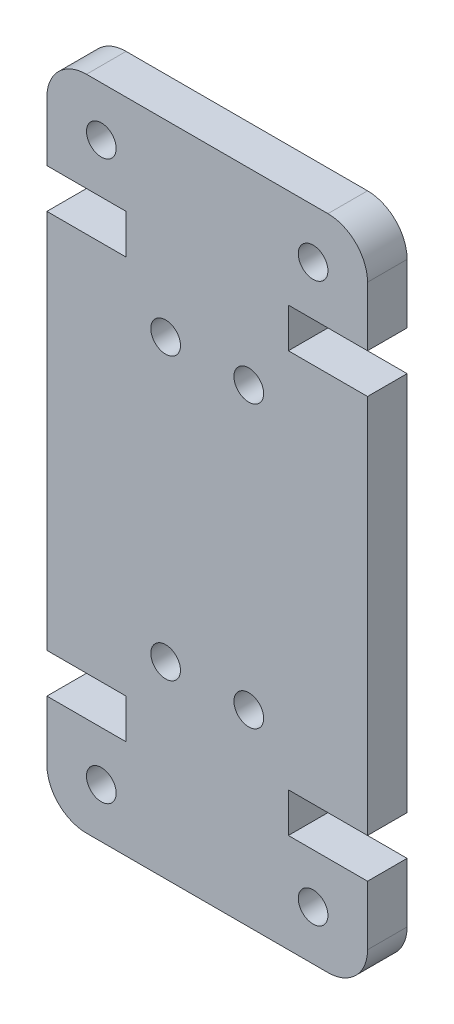
ISO-10303-21;
HEADER;
FILE_DESCRIPTION(('STEP AP214'),'2;1');
FILE_NAME('part.step','',(''),(''),'','','');
FILE_SCHEMA(('AUTOMOTIVE_DESIGN { 1 0 10303 214 1 1 1 1 }'));
ENDSEC;
DATA;
#1=APPLICATION_CONTEXT('core data for automotive mechanical design processes');
#2=APPLICATION_PROTOCOL_DEFINITION('international standard','automotive_design',2000,#1);
#3=PRODUCT_CONTEXT('',#1,'mechanical');
#4=PRODUCT('Part','Part','',(#3));
#5=PRODUCT_RELATED_PRODUCT_CATEGORY('part','',(#4));
#6=PRODUCT_DEFINITION_FORMATION('','',#4);
#7=PRODUCT_DEFINITION_CONTEXT('part definition',#1,'design');
#8=PRODUCT_DEFINITION('design','',#6,#7);
#9=PRODUCT_DEFINITION_SHAPE('','',#8);
#10=(LENGTH_UNIT() NAMED_UNIT(*) SI_UNIT(.MILLI.,.METRE.));
#11=(NAMED_UNIT(*) PLANE_ANGLE_UNIT() SI_UNIT($,.RADIAN.));
#12=(NAMED_UNIT(*) SI_UNIT($,.STERADIAN.) SOLID_ANGLE_UNIT());
#13=UNCERTAINTY_MEASURE_WITH_UNIT(LENGTH_MEASURE(1.E-05),#10,'distance_accuracy_value','');
#14=(GEOMETRIC_REPRESENTATION_CONTEXT(3) GLOBAL_UNCERTAINTY_ASSIGNED_CONTEXT((#13)) GLOBAL_UNIT_ASSIGNED_CONTEXT((#10,
#11,#12)) REPRESENTATION_CONTEXT('',''));
#15=CARTESIAN_POINT('',(0.,0.,0.));
#16=DIRECTION('',(0.,0.,1.));
#17=DIRECTION('',(1.,0.,0.));
#18=AXIS2_PLACEMENT_3D('',#15,#16,#17);
#19=CARTESIAN_POINT('',(2.00000000000001,2.,2.));
#20=DIRECTION('',(0.,0.,1.));
#21=DIRECTION('',(1.,0.,0.));
#22=AXIS2_PLACEMENT_3D('',#19,#20,#21);
#23=PLANE('',#22);
#24=CARTESIAN_POINT('',(10.2,23.7100000000004,2.));
#25=DIRECTION('',(0.,0.,1.));
#26=DIRECTION('',(1.,0.,0.));
#27=AXIS2_PLACEMENT_3D('',#24,#25,#26);
#28=CIRCLE('',#27,0.749999999999999);
#29=CARTESIAN_POINT('',(10.95,23.7100000000004,2.));
#30=VERTEX_POINT('',#29);
#31=EDGE_CURVE('E464',#30,#30,#28,.T.);
#32=ORIENTED_EDGE('',*,*,#31,.F.);
#33=EDGE_LOOP('',(#32));
#34=FACE_BOUND('',#33,.T.);
#35=CARTESIAN_POINT('',(6.,9.49999999999962,2.));
#36=DIRECTION('',(0.,0.,1.));
#37=DIRECTION('',(1.,0.,0.));
#38=AXIS2_PLACEMENT_3D('',#35,#36,#37);
#39=CIRCLE('',#38,0.75);
#40=CARTESIAN_POINT('',(6.75,9.49999999999962,2.));
#41=VERTEX_POINT('',#40);
#42=EDGE_CURVE('E476',#41,#41,#39,.T.);
#43=ORIENTED_EDGE('',*,*,#42,.F.);
#44=EDGE_LOOP('',(#43));
#45=FACE_BOUND('',#44,.T.);
#46=CARTESIAN_POINT('',(2.75000000000003,30.7099999999998,2.));
#47=DIRECTION('',(0.,0.,1.));
#48=DIRECTION('',(-1.,0.,0.));
#49=AXIS2_PLACEMENT_3D('',#46,#47,#48);
#50=CIRCLE('',#49,0.75);
#51=CARTESIAN_POINT('',(2.00000000000003,30.7099999999998,2.));
#52=VERTEX_POINT('',#51);
#53=EDGE_CURVE('E488',#52,#52,#50,.T.);
#54=ORIENTED_EDGE('',*,*,#53,.F.);
#55=EDGE_LOOP('',(#54));
#56=FACE_BOUND('',#55,.T.);
#57=CARTESIAN_POINT('',(13.45,2.50000000000017,2.));
#58=DIRECTION('',(0.,0.,1.));
#59=DIRECTION('',(-1.,0.,0.));
#60=AXIS2_PLACEMENT_3D('',#57,#58,#59);
#61=CIRCLE('',#60,0.750000000000008);
#62=CARTESIAN_POINT('',(12.7,2.50000000000017,2.));
#63=VERTEX_POINT('',#62);
#64=EDGE_CURVE('E230',#63,#63,#61,.T.);
#65=ORIENTED_EDGE('',*,*,#64,.F.);
#66=EDGE_LOOP('',(#65));
#67=FACE_BOUND('',#66,.T.);
#68=DIRECTION('',(1.,0.,0.));
#69=VECTOR('',#68,1.);
#70=CARTESIAN_POINT('',(0.,6.99999999999946,2.));
#71=LINE('',#70,#69);
#72=CARTESIAN_POINT('',(0.,6.99999999999946,2.));
#73=VERTEX_POINT('',#72);
#74=CARTESIAN_POINT('',(4.00000000000001,6.99999999999946,2.));
#75=VERTEX_POINT('',#74);
#76=EDGE_CURVE('E273',#73,#75,#71,.T.);
#77=ORIENTED_EDGE('',*,*,#76,.T.);
#78=DIRECTION('',(0.,-1.,0.));
#79=VECTOR('',#78,1.);
#80=CARTESIAN_POINT('',(4.00000000000001,6.99999999999946,2.));
#81=LINE('',#80,#79);
#82=CARTESIAN_POINT('',(4.,4.99999999999945,2.));
#83=VERTEX_POINT('',#82);
#84=EDGE_CURVE('E141',#75,#83,#81,.T.);
#85=ORIENTED_EDGE('',*,*,#84,.T.);
#86=DIRECTION('',(-1.,0.,0.));
#87=VECTOR('',#86,1.);
#88=CARTESIAN_POINT('',(4.,4.99999999999945,2.));
#89=LINE('',#88,#87);
#90=CARTESIAN_POINT('',(0.,4.99999999999945,2.));
#91=VERTEX_POINT('',#90);
#92=EDGE_CURVE('E336',#83,#91,#89,.T.);
#93=ORIENTED_EDGE('',*,*,#92,.T.);
#94=DIRECTION('',(0.,-1.,0.));
#95=VECTOR('',#94,1.);
#96=CARTESIAN_POINT('',(0.,2.,2.));
#97=LINE('',#96,#95);
#98=CARTESIAN_POINT('',(0.,2.,2.));
#99=VERTEX_POINT('',#98);
#100=EDGE_CURVE('E355',#91,#99,#97,.T.);
#101=ORIENTED_EDGE('',*,*,#100,.T.);
#102=CARTESIAN_POINT('',(2.00000000000001,2.,2.));
#103=DIRECTION('',(0.,0.,1.));
#104=DIRECTION('',(1.,0.,0.));
#105=AXIS2_PLACEMENT_3D('',#102,#103,#104);
#106=CIRCLE('',#105,2.00000000000001);
#107=CARTESIAN_POINT('',(2.00000000000001,0.,2.));
#108=VERTEX_POINT('',#107);
#109=EDGE_CURVE('E352',#99,#108,#106,.T.);
#110=ORIENTED_EDGE('',*,*,#109,.T.);
#111=DIRECTION('',(1.,0.,0.));
#112=VECTOR('',#111,1.);
#113=CARTESIAN_POINT('',(2.00000000000001,0.,2.));
#114=LINE('',#113,#112);
#115=CARTESIAN_POINT('',(14.2,0.,2.));
#116=VERTEX_POINT('',#115);
#117=EDGE_CURVE('E354',#108,#116,#114,.T.);
#118=ORIENTED_EDGE('',*,*,#117,.T.);
#119=CARTESIAN_POINT('',(14.2,2.,2.));
#120=DIRECTION('',(0.,0.,1.));
#121=DIRECTION('',(-1.,0.,0.));
#122=AXIS2_PLACEMENT_3D('',#119,#120,#121);
#123=CIRCLE('',#122,2.);
#124=CARTESIAN_POINT('',(16.2,2.,2.));
#125=VERTEX_POINT('',#124);
#126=EDGE_CURVE('E357',#116,#125,#123,.T.);
#127=ORIENTED_EDGE('',*,*,#126,.T.);
#128=DIRECTION('',(0.,1.,0.));
#129=VECTOR('',#128,1.);
#130=CARTESIAN_POINT('',(16.2,2.,2.));
#131=LINE('',#130,#129);
#132=CARTESIAN_POINT('',(16.2,4.99999999999945,2.));
#133=VERTEX_POINT('',#132);
#134=EDGE_CURVE('E363',#125,#133,#131,.T.);
#135=ORIENTED_EDGE('',*,*,#134,.T.);
#136=DIRECTION('',(-1.,0.,0.));
#137=VECTOR('',#136,1.);
#138=CARTESIAN_POINT('',(12.2,4.99999999999945,2.));
#139=LINE('',#138,#137);
#140=CARTESIAN_POINT('',(12.2,4.99999999999945,2.));
#141=VERTEX_POINT('',#140);
#142=EDGE_CURVE('E365',#133,#141,#139,.T.);
#143=ORIENTED_EDGE('',*,*,#142,.T.);
#144=DIRECTION('',(0.,1.,0.));
#145=VECTOR('',#144,1.);
#146=CARTESIAN_POINT('',(12.2,6.99999999999945,2.));
#147=LINE('',#146,#145);
#148=CARTESIAN_POINT('',(12.2,6.99999999999945,2.));
#149=VERTEX_POINT('',#148);
#150=EDGE_CURVE('E367',#141,#149,#147,.T.);
#151=ORIENTED_EDGE('',*,*,#150,.T.);
#152=DIRECTION('',(1.,0.,0.));
#153=VECTOR('',#152,1.);
#154=CARTESIAN_POINT('',(16.2,6.99999999999945,2.));
#155=LINE('',#154,#153);
#156=CARTESIAN_POINT('',(16.2,6.99999999999945,2.));
#157=VERTEX_POINT('',#156);
#158=EDGE_CURVE('E369',#149,#157,#155,.T.);
#159=ORIENTED_EDGE('',*,*,#158,.T.);
#160=DIRECTION('',(0.,1.,0.));
#161=VECTOR('',#160,1.);
#162=CARTESIAN_POINT('',(16.2,26.2100000000006,2.));
#163=LINE('',#162,#161);
#164=CARTESIAN_POINT('',(16.2,26.2100000000006,2.));
#165=VERTEX_POINT('',#164);
#166=EDGE_CURVE('E371',#157,#165,#163,.T.);
#167=ORIENTED_EDGE('',*,*,#166,.T.);
#168=DIRECTION('',(-1.,0.,0.));
#169=VECTOR('',#168,1.);
#170=CARTESIAN_POINT('',(16.2,26.2100000000006,2.));
#171=LINE('',#170,#169);
#172=CARTESIAN_POINT('',(12.2,26.2100000000006,2.));
#173=VERTEX_POINT('',#172);
#174=EDGE_CURVE('E373',#165,#173,#171,.T.);
#175=ORIENTED_EDGE('',*,*,#174,.T.);
#176=DIRECTION('',(0.,1.,0.));
#177=VECTOR('',#176,1.);
#178=CARTESIAN_POINT('',(12.2,26.2100000000006,2.));
#179=LINE('',#178,#177);
#180=CARTESIAN_POINT('',(12.2,28.2100000000006,2.));
#181=VERTEX_POINT('',#180);
#182=EDGE_CURVE('E375',#173,#181,#179,.T.);
#183=ORIENTED_EDGE('',*,*,#182,.T.);
#184=DIRECTION('',(1.,0.,0.));
#185=VECTOR('',#184,1.);
#186=CARTESIAN_POINT('',(12.2,28.2100000000006,2.));
#187=LINE('',#186,#185);
#188=CARTESIAN_POINT('',(16.2,28.2100000000006,2.));
#189=VERTEX_POINT('',#188);
#190=EDGE_CURVE('E377',#181,#189,#187,.T.);
#191=ORIENTED_EDGE('',*,*,#190,.T.);
#192=DIRECTION('',(0.,1.,0.));
#193=VECTOR('',#192,1.);
#194=CARTESIAN_POINT('',(16.2,31.21,2.));
#195=LINE('',#194,#193);
#196=CARTESIAN_POINT('',(16.2,31.21,2.));
#197=VERTEX_POINT('',#196);
#198=EDGE_CURVE('E379',#189,#197,#195,.T.);
#199=ORIENTED_EDGE('',*,*,#198,.T.);
#200=CARTESIAN_POINT('',(14.2,31.21,2.));
#201=DIRECTION('',(0.,0.,1.));
#202=DIRECTION('',(1.,0.,0.));
#203=AXIS2_PLACEMENT_3D('',#200,#201,#202);
#204=CIRCLE('',#203,2.);
#205=CARTESIAN_POINT('',(14.2,33.21,2.));
#206=VERTEX_POINT('',#205);
#207=EDGE_CURVE('E381',#197,#206,#204,.T.);
#208=ORIENTED_EDGE('',*,*,#207,.T.);
#209=DIRECTION('',(-1.,0.,0.));
#210=VECTOR('',#209,1.);
#211=CARTESIAN_POINT('',(1.99999999999999,33.21,2.));
#212=LINE('',#211,#210);
#213=CARTESIAN_POINT('',(1.99999999999999,33.21,2.));
#214=VERTEX_POINT('',#213);
#215=EDGE_CURVE('E383',#206,#214,#212,.T.);
#216=ORIENTED_EDGE('',*,*,#215,.T.);
#217=CARTESIAN_POINT('',(1.99999999999999,31.21,2.));
#218=DIRECTION('',(0.,0.,1.));
#219=DIRECTION('',(-1.,0.,0.));
#220=AXIS2_PLACEMENT_3D('',#217,#218,#219);
#221=CIRCLE('',#220,2.);
#222=CARTESIAN_POINT('',(0.,31.21,2.));
#223=VERTEX_POINT('',#222);
#224=EDGE_CURVE('E385',#214,#223,#221,.T.);
#225=ORIENTED_EDGE('',*,*,#224,.T.);
#226=DIRECTION('',(0.,-1.,0.));
#227=VECTOR('',#226,1.);
#228=CARTESIAN_POINT('',(0.,31.21,2.));
#229=LINE('',#228,#227);
#230=CARTESIAN_POINT('',(0.,28.2100000000006,2.));
#231=VERTEX_POINT('',#230);
#232=EDGE_CURVE('E387',#223,#231,#229,.T.);
#233=ORIENTED_EDGE('',*,*,#232,.T.);
#234=DIRECTION('',(1.,0.,0.));
#235=VECTOR('',#234,1.);
#236=CARTESIAN_POINT('',(3.99999999999999,28.2100000000006,2.));
#237=LINE('',#236,#235);
#238=CARTESIAN_POINT('',(3.99999999999999,28.2100000000006,2.));
#239=VERTEX_POINT('',#238);
#240=EDGE_CURVE('E208',#231,#239,#237,.T.);
#241=ORIENTED_EDGE('',*,*,#240,.T.);
#242=DIRECTION('',(0.,-1.,0.));
#243=VECTOR('',#242,1.);
#244=CARTESIAN_POINT('',(4.,26.2100000000006,2.));
#245=LINE('',#244,#243);
#246=CARTESIAN_POINT('',(4.,26.2100000000006,2.));
#247=VERTEX_POINT('',#246);
#248=EDGE_CURVE('E202',#239,#247,#245,.T.);
#249=ORIENTED_EDGE('',*,*,#248,.T.);
#250=DIRECTION('',(-1.,0.,0.));
#251=VECTOR('',#250,1.);
#252=CARTESIAN_POINT('',(0.,26.2100000000005,2.));
#253=LINE('',#252,#251);
#254=CARTESIAN_POINT('',(0.,26.2100000000005,2.));
#255=VERTEX_POINT('',#254);
#256=EDGE_CURVE('E206',#247,#255,#253,.T.);
#257=ORIENTED_EDGE('',*,*,#256,.T.);
#258=DIRECTION('',(0.,-1.,0.));
#259=VECTOR('',#258,1.);
#260=CARTESIAN_POINT('',(0.,26.2100000000005,2.));
#261=LINE('',#260,#259);
#262=EDGE_CURVE('E50',#255,#73,#261,.T.);
#263=ORIENTED_EDGE('',*,*,#262,.T.);
#264=EDGE_LOOP('',(#77,#85,#93,#101,#110,#118,#127,#135,#143,#151,#159,#167,#175,#183,#191,#199,
#208,#216,#225,#233,#241,#249,#257,#263));
#265=FACE_BOUND('',#264,.T.);
#266=CARTESIAN_POINT('',(10.2,9.49999999999962,2.));
#267=DIRECTION('',(0.,0.,1.));
#268=DIRECTION('',(-1.,0.,0.));
#269=AXIS2_PLACEMENT_3D('',#266,#267,#268);
#270=CIRCLE('',#269,0.750000000000002);
#271=CARTESIAN_POINT('',(9.45,9.49999999999962,2.));
#272=VERTEX_POINT('',#271);
#273=EDGE_CURVE('E494',#272,#272,#270,.T.);
#274=ORIENTED_EDGE('',*,*,#273,.F.);
#275=EDGE_LOOP('',(#274));
#276=FACE_BOUND('',#275,.T.);
#277=CARTESIAN_POINT('',(5.99999999999999,23.7100000000004,2.));
#278=DIRECTION('',(0.,0.,1.));
#279=DIRECTION('',(-1.,0.,0.));
#280=AXIS2_PLACEMENT_3D('',#277,#278,#279);
#281=CIRCLE('',#280,0.750000000000001);
#282=CARTESIAN_POINT('',(5.24999999999999,23.7100000000004,2.));
#283=VERTEX_POINT('',#282);
#284=EDGE_CURVE('E482',#283,#283,#281,.T.);
#285=ORIENTED_EDGE('',*,*,#284,.F.);
#286=EDGE_LOOP('',(#285));
#287=FACE_BOUND('',#286,.T.);
#288=CARTESIAN_POINT('',(2.75000000000004,2.50000000000017,2.));
#289=DIRECTION('',(0.,0.,1.));
#290=DIRECTION('',(1.,0.,0.));
#291=AXIS2_PLACEMENT_3D('',#288,#289,#290);
#292=CIRCLE('',#291,0.75);
#293=CARTESIAN_POINT('',(3.50000000000004,2.50000000000017,2.));
#294=VERTEX_POINT('',#293);
#295=EDGE_CURVE('E470',#294,#294,#292,.T.);
#296=ORIENTED_EDGE('',*,*,#295,.F.);
#297=EDGE_LOOP('',(#296));
#298=FACE_BOUND('',#297,.T.);
#299=CARTESIAN_POINT('',(13.45,30.7099999999998,2.));
#300=DIRECTION('',(0.,0.,1.));
#301=DIRECTION('',(1.,0.,0.));
#302=AXIS2_PLACEMENT_3D('',#299,#300,#301);
#303=CIRCLE('',#302,0.750000000000007);
#304=CARTESIAN_POINT('',(14.2,30.7099999999998,2.));
#305=VERTEX_POINT('',#304);
#306=EDGE_CURVE('E455',#305,#305,#303,.T.);
#307=ORIENTED_EDGE('',*,*,#306,.F.);
#308=EDGE_LOOP('',(#307));
#309=FACE_BOUND('',#308,.T.);
#310=ADVANCED_FACE('F33',(#34,#45,#56,#67,#265,#276,#287,#298,#309),#23,.T.);
#311=CARTESIAN_POINT('',(2.00000000000001,2.,0.));
#312=DIRECTION('',(0.,0.,1.));
#313=DIRECTION('',(1.,0.,0.));
#314=AXIS2_PLACEMENT_3D('',#311,#312,#313);
#315=PLANE('',#314);
#316=CARTESIAN_POINT('',(10.2,23.7100000000004,0.));
#317=DIRECTION('',(0.,0.,1.));
#318=DIRECTION('',(1.,0.,0.));
#319=AXIS2_PLACEMENT_3D('',#316,#317,#318);
#320=CIRCLE('',#319,0.749999999999999);
#321=CARTESIAN_POINT('',(10.95,23.7100000000004,0.));
#322=VERTEX_POINT('',#321);
#323=EDGE_CURVE('E461',#322,#322,#320,.T.);
#324=ORIENTED_EDGE('',*,*,#323,.T.);
#325=EDGE_LOOP('',(#324));
#326=FACE_BOUND('',#325,.T.);
#327=CARTESIAN_POINT('',(6.,9.49999999999962,0.));
#328=DIRECTION('',(0.,0.,1.));
#329=DIRECTION('',(1.,0.,0.));
#330=AXIS2_PLACEMENT_3D('',#327,#328,#329);
#331=CIRCLE('',#330,0.75);
#332=CARTESIAN_POINT('',(6.75,9.49999999999962,0.));
#333=VERTEX_POINT('',#332);
#334=EDGE_CURVE('E473',#333,#333,#331,.T.);
#335=ORIENTED_EDGE('',*,*,#334,.T.);
#336=EDGE_LOOP('',(#335));
#337=FACE_BOUND('',#336,.T.);
#338=CARTESIAN_POINT('',(2.75000000000003,30.7099999999998,0.));
#339=DIRECTION('',(0.,0.,1.));
#340=DIRECTION('',(-1.,0.,0.));
#341=AXIS2_PLACEMENT_3D('',#338,#339,#340);
#342=CIRCLE('',#341,0.75);
#343=CARTESIAN_POINT('',(2.00000000000003,30.7099999999998,0.));
#344=VERTEX_POINT('',#343);
#345=EDGE_CURVE('E485',#344,#344,#342,.T.);
#346=ORIENTED_EDGE('',*,*,#345,.T.);
#347=EDGE_LOOP('',(#346));
#348=FACE_BOUND('',#347,.T.);
#349=CARTESIAN_POINT('',(13.45,2.50000000000017,0.));
#350=DIRECTION('',(0.,0.,1.));
#351=DIRECTION('',(-1.,0.,0.));
#352=AXIS2_PLACEMENT_3D('',#349,#350,#351);
#353=CIRCLE('',#352,0.750000000000008);
#354=CARTESIAN_POINT('',(12.7,2.50000000000017,0.));
#355=VERTEX_POINT('',#354);
#356=EDGE_CURVE('E497',#355,#355,#353,.T.);
#357=ORIENTED_EDGE('',*,*,#356,.T.);
#358=EDGE_LOOP('',(#357));
#359=FACE_BOUND('',#358,.T.);
#360=DIRECTION('',(1.,0.,0.));
#361=VECTOR('',#360,1.);
#362=CARTESIAN_POINT('',(0.,6.99999999999946,0.));
#363=LINE('',#362,#361);
#364=CARTESIAN_POINT('',(0.,6.99999999999946,0.));
#365=VERTEX_POINT('',#364);
#366=CARTESIAN_POINT('',(4.00000000000001,6.99999999999946,0.));
#367=VERTEX_POINT('',#366);
#368=EDGE_CURVE('E226',#365,#367,#363,.T.);
#369=ORIENTED_EDGE('',*,*,#368,.F.);
#370=DIRECTION('',(0.,-1.,0.));
#371=VECTOR('',#370,1.);
#372=CARTESIAN_POINT('',(0.,26.2100000000005,0.));
#373=LINE('',#372,#371);
#374=CARTESIAN_POINT('',(0.,26.2100000000005,0.));
#375=VERTEX_POINT('',#374);
#376=EDGE_CURVE('E133',#375,#365,#373,.T.);
#377=ORIENTED_EDGE('',*,*,#376,.F.);
#378=DIRECTION('',(-1.,0.,0.));
#379=VECTOR('',#378,1.);
#380=CARTESIAN_POINT('',(0.,26.2100000000005,0.));
#381=LINE('',#380,#379);
#382=CARTESIAN_POINT('',(4.,26.2100000000006,0.));
#383=VERTEX_POINT('',#382);
#384=EDGE_CURVE('E127',#383,#375,#381,.T.);
#385=ORIENTED_EDGE('',*,*,#384,.F.);
#386=DIRECTION('',(0.,-1.,0.));
#387=VECTOR('',#386,1.);
#388=CARTESIAN_POINT('',(4.,26.2100000000006,0.));
#389=LINE('',#388,#387);
#390=CARTESIAN_POINT('',(3.99999999999999,28.2100000000006,0.));
#391=VERTEX_POINT('',#390);
#392=EDGE_CURVE('E216',#391,#383,#389,.T.);
#393=ORIENTED_EDGE('',*,*,#392,.F.);
#394=DIRECTION('',(1.,0.,0.));
#395=VECTOR('',#394,1.);
#396=CARTESIAN_POINT('',(3.99999999999999,28.2100000000006,0.));
#397=LINE('',#396,#395);
#398=CARTESIAN_POINT('',(0.,28.2100000000006,0.));
#399=VERTEX_POINT('',#398);
#400=EDGE_CURVE('E268',#399,#391,#397,.T.);
#401=ORIENTED_EDGE('',*,*,#400,.F.);
#402=DIRECTION('',(0.,-1.,0.));
#403=VECTOR('',#402,1.);
#404=CARTESIAN_POINT('',(0.,31.21,0.));
#405=LINE('',#404,#403);
#406=CARTESIAN_POINT('',(0.,31.21,0.));
#407=VERTEX_POINT('',#406);
#408=EDGE_CURVE('E266',#407,#399,#405,.T.);
#409=ORIENTED_EDGE('',*,*,#408,.F.);
#410=CARTESIAN_POINT('',(1.99999999999999,31.21,0.));
#411=DIRECTION('',(0.,0.,1.));
#412=DIRECTION('',(-1.,0.,0.));
#413=AXIS2_PLACEMENT_3D('',#410,#411,#412);
#414=CIRCLE('',#413,2.);
#415=CARTESIAN_POINT('',(1.99999999999999,33.21,0.));
#416=VERTEX_POINT('',#415);
#417=EDGE_CURVE('E264',#416,#407,#414,.T.);
#418=ORIENTED_EDGE('',*,*,#417,.F.);
#419=DIRECTION('',(-1.,0.,0.));
#420=VECTOR('',#419,1.);
#421=CARTESIAN_POINT('',(1.99999999999999,33.21,0.));
#422=LINE('',#421,#420);
#423=CARTESIAN_POINT('',(14.2,33.21,0.));
#424=VERTEX_POINT('',#423);
#425=EDGE_CURVE('E262',#424,#416,#422,.T.);
#426=ORIENTED_EDGE('',*,*,#425,.F.);
#427=CARTESIAN_POINT('',(14.2,31.21,0.));
#428=DIRECTION('',(0.,0.,1.));
#429=DIRECTION('',(1.,0.,0.));
#430=AXIS2_PLACEMENT_3D('',#427,#428,#429);
#431=CIRCLE('',#430,2.);
#432=CARTESIAN_POINT('',(16.2,31.21,0.));
#433=VERTEX_POINT('',#432);
#434=EDGE_CURVE('E260',#433,#424,#431,.T.);
#435=ORIENTED_EDGE('',*,*,#434,.F.);
#436=DIRECTION('',(0.,1.,0.));
#437=VECTOR('',#436,1.);
#438=CARTESIAN_POINT('',(16.2,31.21,0.));
#439=LINE('',#438,#437);
#440=CARTESIAN_POINT('',(16.2,28.2100000000006,0.));
#441=VERTEX_POINT('',#440);
#442=EDGE_CURVE('E258',#441,#433,#439,.T.);
#443=ORIENTED_EDGE('',*,*,#442,.F.);
#444=DIRECTION('',(1.,0.,0.));
#445=VECTOR('',#444,1.);
#446=CARTESIAN_POINT('',(12.2,28.2100000000006,0.));
#447=LINE('',#446,#445);
#448=CARTESIAN_POINT('',(12.2,28.2100000000006,0.));
#449=VERTEX_POINT('',#448);
#450=EDGE_CURVE('E256',#449,#441,#447,.T.);
#451=ORIENTED_EDGE('',*,*,#450,.F.);
#452=DIRECTION('',(0.,1.,0.));
#453=VECTOR('',#452,1.);
#454=CARTESIAN_POINT('',(12.2,26.2100000000006,0.));
#455=LINE('',#454,#453);
#456=CARTESIAN_POINT('',(12.2,26.2100000000006,0.));
#457=VERTEX_POINT('',#456);
#458=EDGE_CURVE('E254',#457,#449,#455,.T.);
#459=ORIENTED_EDGE('',*,*,#458,.F.);
#460=DIRECTION('',(-1.,0.,0.));
#461=VECTOR('',#460,1.);
#462=CARTESIAN_POINT('',(16.2,26.2100000000006,0.));
#463=LINE('',#462,#461);
#464=CARTESIAN_POINT('',(16.2,26.2100000000006,0.));
#465=VERTEX_POINT('',#464);
#466=EDGE_CURVE('E252',#465,#457,#463,.T.);
#467=ORIENTED_EDGE('',*,*,#466,.F.);
#468=DIRECTION('',(0.,1.,0.));
#469=VECTOR('',#468,1.);
#470=CARTESIAN_POINT('',(16.2,26.2100000000006,0.));
#471=LINE('',#470,#469);
#472=CARTESIAN_POINT('',(16.2,6.99999999999945,0.));
#473=VERTEX_POINT('',#472);
#474=EDGE_CURVE('E250',#473,#465,#471,.T.);
#475=ORIENTED_EDGE('',*,*,#474,.F.);
#476=DIRECTION('',(1.,0.,0.));
#477=VECTOR('',#476,1.);
#478=CARTESIAN_POINT('',(16.2,6.99999999999945,0.));
#479=LINE('',#478,#477);
#480=CARTESIAN_POINT('',(12.2,6.99999999999945,0.));
#481=VERTEX_POINT('',#480);
#482=EDGE_CURVE('E248',#481,#473,#479,.T.);
#483=ORIENTED_EDGE('',*,*,#482,.F.);
#484=DIRECTION('',(0.,1.,0.));
#485=VECTOR('',#484,1.);
#486=CARTESIAN_POINT('',(12.2,6.99999999999945,0.));
#487=LINE('',#486,#485);
#488=CARTESIAN_POINT('',(12.2,4.99999999999945,0.));
#489=VERTEX_POINT('',#488);
#490=EDGE_CURVE('E246',#489,#481,#487,.T.);
#491=ORIENTED_EDGE('',*,*,#490,.F.);
#492=DIRECTION('',(-1.,0.,0.));
#493=VECTOR('',#492,1.);
#494=CARTESIAN_POINT('',(12.2,4.99999999999945,0.));
#495=LINE('',#494,#493);
#496=CARTESIAN_POINT('',(16.2,4.99999999999945,0.));
#497=VERTEX_POINT('',#496);
#498=EDGE_CURVE('E244',#497,#489,#495,.T.);
#499=ORIENTED_EDGE('',*,*,#498,.F.);
#500=DIRECTION('',(0.,1.,0.));
#501=VECTOR('',#500,1.);
#502=CARTESIAN_POINT('',(16.2,2.,0.));
#503=LINE('',#502,#501);
#504=CARTESIAN_POINT('',(16.2,2.,0.));
#505=VERTEX_POINT('',#504);
#506=EDGE_CURVE('E242',#505,#497,#503,.T.);
#507=ORIENTED_EDGE('',*,*,#506,.F.);
#508=CARTESIAN_POINT('',(14.2,2.,0.));
#509=DIRECTION('',(0.,0.,1.));
#510=DIRECTION('',(-1.,0.,0.));
#511=AXIS2_PLACEMENT_3D('',#508,#509,#510);
#512=CIRCLE('',#511,2.);
#513=CARTESIAN_POINT('',(14.2,0.,0.));
#514=VERTEX_POINT('',#513);
#515=EDGE_CURVE('E240',#514,#505,#512,.T.);
#516=ORIENTED_EDGE('',*,*,#515,.F.);
#517=DIRECTION('',(1.,0.,0.));
#518=VECTOR('',#517,1.);
#519=CARTESIAN_POINT('',(2.00000000000001,0.,0.));
#520=LINE('',#519,#518);
#521=CARTESIAN_POINT('',(2.00000000000001,0.,0.));
#522=VERTEX_POINT('',#521);
#523=EDGE_CURVE('E238',#522,#514,#520,.T.);
#524=ORIENTED_EDGE('',*,*,#523,.F.);
#525=CARTESIAN_POINT('',(2.00000000000001,2.,0.));
#526=DIRECTION('',(0.,0.,1.));
#527=DIRECTION('',(1.,0.,0.));
#528=AXIS2_PLACEMENT_3D('',#525,#526,#527);
#529=CIRCLE('',#528,2.00000000000001);
#530=CARTESIAN_POINT('',(0.,2.,0.));
#531=VERTEX_POINT('',#530);
#532=EDGE_CURVE('E236',#531,#522,#529,.T.);
#533=ORIENTED_EDGE('',*,*,#532,.F.);
#534=DIRECTION('',(0.,-1.,0.));
#535=VECTOR('',#534,1.);
#536=CARTESIAN_POINT('',(0.,2.,0.));
#537=LINE('',#536,#535);
#538=CARTESIAN_POINT('',(0.,4.99999999999945,0.));
#539=VERTEX_POINT('',#538);
#540=EDGE_CURVE('E234',#539,#531,#537,.T.);
#541=ORIENTED_EDGE('',*,*,#540,.F.);
#542=DIRECTION('',(-1.,0.,0.));
#543=VECTOR('',#542,1.);
#544=CARTESIAN_POINT('',(4.,4.99999999999945,0.));
#545=LINE('',#544,#543);
#546=CARTESIAN_POINT('',(4.,4.99999999999945,0.));
#547=VERTEX_POINT('',#546);
#548=EDGE_CURVE('E232',#547,#539,#545,.T.);
#549=ORIENTED_EDGE('',*,*,#548,.F.);
#550=DIRECTION('',(0.,-1.,0.));
#551=VECTOR('',#550,1.);
#552=CARTESIAN_POINT('',(4.00000000000001,6.99999999999946,0.));
#553=LINE('',#552,#551);
#554=EDGE_CURVE('E229',#367,#547,#553,.T.);
#555=ORIENTED_EDGE('',*,*,#554,.F.);
#556=EDGE_LOOP('',(#369,#377,#385,#393,#401,#409,#418,#426,#435,#443,#451,#459,#467,#475,#483,
#491,#499,#507,#516,#524,#533,#541,#549,#555));
#557=FACE_BOUND('',#556,.T.);
#558=CARTESIAN_POINT('',(10.2,9.49999999999962,0.));
#559=DIRECTION('',(0.,0.,1.));
#560=DIRECTION('',(-1.,0.,0.));
#561=AXIS2_PLACEMENT_3D('',#558,#559,#560);
#562=CIRCLE('',#561,0.750000000000002);
#563=CARTESIAN_POINT('',(9.45,9.49999999999962,0.));
#564=VERTEX_POINT('',#563);
#565=EDGE_CURVE('E491',#564,#564,#562,.T.);
#566=ORIENTED_EDGE('',*,*,#565,.T.);
#567=EDGE_LOOP('',(#566));
#568=FACE_BOUND('',#567,.T.);
#569=CARTESIAN_POINT('',(5.99999999999999,23.7100000000004,0.));
#570=DIRECTION('',(0.,0.,1.));
#571=DIRECTION('',(-1.,0.,0.));
#572=AXIS2_PLACEMENT_3D('',#569,#570,#571);
#573=CIRCLE('',#572,0.750000000000001);
#574=CARTESIAN_POINT('',(5.24999999999999,23.7100000000004,0.));
#575=VERTEX_POINT('',#574);
#576=EDGE_CURVE('E479',#575,#575,#573,.T.);
#577=ORIENTED_EDGE('',*,*,#576,.T.);
#578=EDGE_LOOP('',(#577));
#579=FACE_BOUND('',#578,.T.);
#580=CARTESIAN_POINT('',(2.75000000000004,2.50000000000017,0.));
#581=DIRECTION('',(0.,0.,1.));
#582=DIRECTION('',(1.,0.,0.));
#583=AXIS2_PLACEMENT_3D('',#580,#581,#582);
#584=CIRCLE('',#583,0.75);
#585=CARTESIAN_POINT('',(3.50000000000004,2.50000000000017,0.));
#586=VERTEX_POINT('',#585);
#587=EDGE_CURVE('E467',#586,#586,#584,.T.);
#588=ORIENTED_EDGE('',*,*,#587,.T.);
#589=EDGE_LOOP('',(#588));
#590=FACE_BOUND('',#589,.T.);
#591=CARTESIAN_POINT('',(13.45,30.7099999999998,0.));
#592=DIRECTION('',(0.,0.,1.));
#593=DIRECTION('',(1.,0.,0.));
#594=AXIS2_PLACEMENT_3D('',#591,#592,#593);
#595=CIRCLE('',#594,0.750000000000007);
#596=CARTESIAN_POINT('',(14.2,30.7099999999998,0.));
#597=VERTEX_POINT('',#596);
#598=EDGE_CURVE('E458',#597,#597,#595,.T.);
#599=ORIENTED_EDGE('',*,*,#598,.T.);
#600=EDGE_LOOP('',(#599));
#601=FACE_BOUND('',#600,.T.);
#602=ADVANCED_FACE('F340',(#326,#337,#348,#359,#557,#568,#579,#590,#601),#315,.F.);
#603=CARTESIAN_POINT('',(0.,6.99999999999946,2.));
#604=DIRECTION('',(0.,1.,0.));
#605=DIRECTION('',(0.,0.,1.));
#606=AXIS2_PLACEMENT_3D('',#603,#604,#605);
#607=PLANE('',#606);
#608=ORIENTED_EDGE('',*,*,#368,.T.);
#609=DIRECTION('',(0.,0.,-1.));
#610=VECTOR('',#609,1.);
#611=CARTESIAN_POINT('',(4.00000000000001,6.99999999999946,2.));
#612=LINE('',#611,#610);
#613=EDGE_CURVE('E11',#75,#367,#612,.T.);
#614=ORIENTED_EDGE('',*,*,#613,.F.);
#615=ORIENTED_EDGE('',*,*,#76,.F.);
#616=DIRECTION('',(0.,0.,-1.));
#617=VECTOR('',#616,1.);
#618=CARTESIAN_POINT('',(0.,6.99999999999946,2.));
#619=LINE('',#618,#617);
#620=EDGE_CURVE('E222',#73,#365,#619,.T.);
#621=ORIENTED_EDGE('',*,*,#620,.T.);
#622=EDGE_LOOP('',(#608,#614,#615,#621));
#623=FACE_BOUND('',#622,.T.);
#624=ADVANCED_FACE('F35',(#623),#607,.F.);
#625=CARTESIAN_POINT('',(4.00000000000001,6.99999999999946,2.));
#626=DIRECTION('',(1.,0.,0.));
#627=DIRECTION('',(0.,1.,0.));
#628=AXIS2_PLACEMENT_3D('',#625,#626,#627);
#629=PLANE('',#628);
#630=ORIENTED_EDGE('',*,*,#554,.T.);
#631=DIRECTION('',(0.,0.,-1.));
#632=VECTOR('',#631,1.);
#633=CARTESIAN_POINT('',(4.,4.99999999999945,2.));
#634=LINE('',#633,#632);
#635=EDGE_CURVE('E42',#83,#547,#634,.T.);
#636=ORIENTED_EDGE('',*,*,#635,.F.);
#637=ORIENTED_EDGE('',*,*,#84,.F.);
#638=ORIENTED_EDGE('',*,*,#613,.T.);
#639=EDGE_LOOP('',(#630,#636,#637,#638));
#640=FACE_BOUND('',#639,.T.);
#641=ADVANCED_FACE('F762',(#640),#629,.F.);
#642=CARTESIAN_POINT('',(4.,4.99999999999945,2.));
#643=DIRECTION('',(0.,-1.,0.));
#644=DIRECTION('',(0.,0.,-1.));
#645=AXIS2_PLACEMENT_3D('',#642,#643,#644);
#646=PLANE('',#645);
#647=ORIENTED_EDGE('',*,*,#548,.T.);
#648=DIRECTION('',(0.,0.,-1.));
#649=VECTOR('',#648,1.);
#650=CARTESIAN_POINT('',(0.,4.99999999999945,2.));
#651=LINE('',#650,#649);
#652=EDGE_CURVE('E328',#91,#539,#651,.T.);
#653=ORIENTED_EDGE('',*,*,#652,.F.);
#654=ORIENTED_EDGE('',*,*,#92,.F.);
#655=ORIENTED_EDGE('',*,*,#635,.T.);
#656=EDGE_LOOP('',(#647,#653,#654,#655));
#657=FACE_BOUND('',#656,.T.);
#658=ADVANCED_FACE('F334',(#657),#646,.F.);
#659=CARTESIAN_POINT('',(0.,2.,2.));
#660=DIRECTION('',(1.,0.,0.));
#661=DIRECTION('',(0.,0.,-1.));
#662=AXIS2_PLACEMENT_3D('',#659,#660,#661);
#663=PLANE('',#662);
#664=ORIENTED_EDGE('',*,*,#540,.T.);
#665=DIRECTION('',(0.,0.,-1.));
#666=VECTOR('',#665,1.);
#667=CARTESIAN_POINT('',(0.,2.,2.));
#668=LINE('',#667,#666);
#669=EDGE_CURVE('E325',#99,#531,#668,.T.);
#670=ORIENTED_EDGE('',*,*,#669,.F.);
#671=ORIENTED_EDGE('',*,*,#100,.F.);
#672=ORIENTED_EDGE('',*,*,#652,.T.);
#673=EDGE_LOOP('',(#664,#670,#671,#672));
#674=FACE_BOUND('',#673,.T.);
#675=ADVANCED_FACE('F346',(#674),#663,.F.);
#676=CARTESIAN_POINT('',(2.00000000000001,2.,2.));
#677=DIRECTION('',(0.,0.,-1.));
#678=DIRECTION('',(-1.,0.,0.));
#679=AXIS2_PLACEMENT_3D('',#676,#677,#678);
#680=CYLINDRICAL_SURFACE('',#679,2.00000000000001);
#681=ORIENTED_EDGE('',*,*,#532,.T.);
#682=DIRECTION('',(0.,0.,-1.));
#683=VECTOR('',#682,1.);
#684=CARTESIAN_POINT('',(2.00000000000001,0.,2.));
#685=LINE('',#684,#683);
#686=EDGE_CURVE('E322',#108,#522,#685,.T.);
#687=ORIENTED_EDGE('',*,*,#686,.F.);
#688=ORIENTED_EDGE('',*,*,#109,.F.);
#689=ORIENTED_EDGE('',*,*,#669,.T.);
#690=EDGE_LOOP('',(#681,#687,#688,#689));
#691=FACE_BOUND('',#690,.T.);
#692=ADVANCED_FACE('F350',(#691),#680,.T.);
#693=CARTESIAN_POINT('',(2.00000000000001,0.,2.));
#694=DIRECTION('',(0.,1.,0.));
#695=DIRECTION('',(-1.,0.,0.));
#696=AXIS2_PLACEMENT_3D('',#693,#694,#695);
#697=PLANE('',#696);
#698=ORIENTED_EDGE('',*,*,#523,.T.);
#699=DIRECTION('',(0.,0.,-1.));
#700=VECTOR('',#699,1.);
#701=CARTESIAN_POINT('',(14.2,0.,2.));
#702=LINE('',#701,#700);
#703=EDGE_CURVE('E319',#116,#514,#702,.T.);
#704=ORIENTED_EDGE('',*,*,#703,.F.);
#705=ORIENTED_EDGE('',*,*,#117,.F.);
#706=ORIENTED_EDGE('',*,*,#686,.T.);
#707=EDGE_LOOP('',(#698,#704,#705,#706));
#708=FACE_BOUND('',#707,.T.);
#709=ADVANCED_FACE('F727',(#708),#697,.F.);
#710=CARTESIAN_POINT('',(14.2,2.,2.));
#711=DIRECTION('',(0.,0.,-1.));
#712=DIRECTION('',(-1.,0.,0.));
#713=AXIS2_PLACEMENT_3D('',#710,#711,#712);
#714=CYLINDRICAL_SURFACE('',#713,2.);
#715=ORIENTED_EDGE('',*,*,#515,.T.);
#716=DIRECTION('',(0.,0.,-1.));
#717=VECTOR('',#716,1.);
#718=CARTESIAN_POINT('',(16.2,2.,2.));
#719=LINE('',#718,#717);
#720=EDGE_CURVE('E316',#125,#505,#719,.T.);
#721=ORIENTED_EDGE('',*,*,#720,.F.);
#722=ORIENTED_EDGE('',*,*,#126,.F.);
#723=ORIENTED_EDGE('',*,*,#703,.T.);
#724=EDGE_LOOP('',(#715,#721,#722,#723));
#725=FACE_BOUND('',#724,.T.);
#726=ADVANCED_FACE('F717',(#725),#714,.T.);
#727=CARTESIAN_POINT('',(16.2,2.,2.));
#728=DIRECTION('',(-1.,0.,0.));
#729=DIRECTION('',(0.,0.,1.));
#730=AXIS2_PLACEMENT_3D('',#727,#728,#729);
#731=PLANE('',#730);
#732=ORIENTED_EDGE('',*,*,#506,.T.);
#733=DIRECTION('',(0.,0.,-1.));
#734=VECTOR('',#733,1.);
#735=CARTESIAN_POINT('',(16.2,4.99999999999945,2.));
#736=LINE('',#735,#734);
#737=EDGE_CURVE('E313',#133,#497,#736,.T.);
#738=ORIENTED_EDGE('',*,*,#737,.F.);
#739=ORIENTED_EDGE('',*,*,#134,.F.);
#740=ORIENTED_EDGE('',*,*,#720,.T.);
#741=EDGE_LOOP('',(#732,#738,#739,#740));
#742=FACE_BOUND('',#741,.T.);
#743=ADVANCED_FACE('F707',(#742),#731,.F.);
#744=CARTESIAN_POINT('',(12.2,4.99999999999945,2.));
#745=DIRECTION('',(0.,-1.,0.));
#746=DIRECTION('',(0.,0.,-1.));
#747=AXIS2_PLACEMENT_3D('',#744,#745,#746);
#748=PLANE('',#747);
#749=ORIENTED_EDGE('',*,*,#498,.T.);
#750=DIRECTION('',(0.,0.,-1.));
#751=VECTOR('',#750,1.);
#752=CARTESIAN_POINT('',(12.2,4.99999999999945,2.));
#753=LINE('',#752,#751);
#754=EDGE_CURVE('E310',#141,#489,#753,.T.);
#755=ORIENTED_EDGE('',*,*,#754,.F.);
#756=ORIENTED_EDGE('',*,*,#142,.F.);
#757=ORIENTED_EDGE('',*,*,#737,.T.);
#758=EDGE_LOOP('',(#749,#755,#756,#757));
#759=FACE_BOUND('',#758,.T.);
#760=ADVANCED_FACE('F697',(#759),#748,.F.);
#761=CARTESIAN_POINT('',(12.2,6.99999999999945,2.));
#762=DIRECTION('',(-1.,0.,0.));
#763=DIRECTION('',(0.,0.,1.));
#764=AXIS2_PLACEMENT_3D('',#761,#762,#763);
#765=PLANE('',#764);
#766=ORIENTED_EDGE('',*,*,#490,.T.);
#767=DIRECTION('',(0.,0.,-1.));
#768=VECTOR('',#767,1.);
#769=CARTESIAN_POINT('',(12.2,6.99999999999945,2.));
#770=LINE('',#769,#768);
#771=EDGE_CURVE('E307',#149,#481,#770,.T.);
#772=ORIENTED_EDGE('',*,*,#771,.F.);
#773=ORIENTED_EDGE('',*,*,#150,.F.);
#774=ORIENTED_EDGE('',*,*,#754,.T.);
#775=EDGE_LOOP('',(#766,#772,#773,#774));
#776=FACE_BOUND('',#775,.T.);
#777=ADVANCED_FACE('F687',(#776),#765,.F.);
#778=CARTESIAN_POINT('',(16.2,6.99999999999945,2.));
#779=DIRECTION('',(0.,1.,0.));
#780=DIRECTION('',(-1.,0.,0.));
#781=AXIS2_PLACEMENT_3D('',#778,#779,#780);
#782=PLANE('',#781);
#783=ORIENTED_EDGE('',*,*,#482,.T.);
#784=DIRECTION('',(0.,0.,-1.));
#785=VECTOR('',#784,1.);
#786=CARTESIAN_POINT('',(16.2,6.99999999999945,2.));
#787=LINE('',#786,#785);
#788=EDGE_CURVE('E304',#157,#473,#787,.T.);
#789=ORIENTED_EDGE('',*,*,#788,.F.);
#790=ORIENTED_EDGE('',*,*,#158,.F.);
#791=ORIENTED_EDGE('',*,*,#771,.T.);
#792=EDGE_LOOP('',(#783,#789,#790,#791));
#793=FACE_BOUND('',#792,.T.);
#794=ADVANCED_FACE('F677',(#793),#782,.F.);
#795=CARTESIAN_POINT('',(16.2,26.2100000000006,2.));
#796=DIRECTION('',(-1.,0.,0.));
#797=DIRECTION('',(0.,0.,1.));
#798=AXIS2_PLACEMENT_3D('',#795,#796,#797);
#799=PLANE('',#798);
#800=ORIENTED_EDGE('',*,*,#474,.T.);
#801=DIRECTION('',(0.,0.,-1.));
#802=VECTOR('',#801,1.);
#803=CARTESIAN_POINT('',(16.2,26.2100000000006,2.));
#804=LINE('',#803,#802);
#805=EDGE_CURVE('E301',#165,#465,#804,.T.);
#806=ORIENTED_EDGE('',*,*,#805,.F.);
#807=ORIENTED_EDGE('',*,*,#166,.F.);
#808=ORIENTED_EDGE('',*,*,#788,.T.);
#809=EDGE_LOOP('',(#800,#806,#807,#808));
#810=FACE_BOUND('',#809,.T.);
#811=ADVANCED_FACE('F667',(#810),#799,.F.);
#812=CARTESIAN_POINT('',(16.2,26.2100000000006,2.));
#813=DIRECTION('',(0.,-1.,0.));
#814=DIRECTION('',(0.,0.,-1.));
#815=AXIS2_PLACEMENT_3D('',#812,#813,#814);
#816=PLANE('',#815);
#817=ORIENTED_EDGE('',*,*,#466,.T.);
#818=DIRECTION('',(0.,0.,-1.));
#819=VECTOR('',#818,1.);
#820=CARTESIAN_POINT('',(12.2,26.2100000000006,2.));
#821=LINE('',#820,#819);
#822=EDGE_CURVE('E298',#173,#457,#821,.T.);
#823=ORIENTED_EDGE('',*,*,#822,.F.);
#824=ORIENTED_EDGE('',*,*,#174,.F.);
#825=ORIENTED_EDGE('',*,*,#805,.T.);
#826=EDGE_LOOP('',(#817,#823,#824,#825));
#827=FACE_BOUND('',#826,.T.);
#828=ADVANCED_FACE('F657',(#827),#816,.F.);
#829=CARTESIAN_POINT('',(12.2,26.2100000000006,2.));
#830=DIRECTION('',(-1.,0.,0.));
#831=DIRECTION('',(0.,0.,1.));
#832=AXIS2_PLACEMENT_3D('',#829,#830,#831);
#833=PLANE('',#832);
#834=ORIENTED_EDGE('',*,*,#458,.T.);
#835=DIRECTION('',(0.,0.,-1.));
#836=VECTOR('',#835,1.);
#837=CARTESIAN_POINT('',(12.2,28.2100000000006,2.));
#838=LINE('',#837,#836);
#839=EDGE_CURVE('E295',#181,#449,#838,.T.);
#840=ORIENTED_EDGE('',*,*,#839,.F.);
#841=ORIENTED_EDGE('',*,*,#182,.F.);
#842=ORIENTED_EDGE('',*,*,#822,.T.);
#843=EDGE_LOOP('',(#834,#840,#841,#842));
#844=FACE_BOUND('',#843,.T.);
#845=ADVANCED_FACE('F647',(#844),#833,.F.);
#846=CARTESIAN_POINT('',(12.2,28.2100000000006,2.));
#847=DIRECTION('',(0.,1.,0.));
#848=DIRECTION('',(0.,0.,1.));
#849=AXIS2_PLACEMENT_3D('',#846,#847,#848);
#850=PLANE('',#849);
#851=ORIENTED_EDGE('',*,*,#450,.T.);
#852=DIRECTION('',(0.,0.,-1.));
#853=VECTOR('',#852,1.);
#854=CARTESIAN_POINT('',(16.2,28.2100000000006,2.));
#855=LINE('',#854,#853);
#856=EDGE_CURVE('E292',#189,#441,#855,.T.);
#857=ORIENTED_EDGE('',*,*,#856,.F.);
#858=ORIENTED_EDGE('',*,*,#190,.F.);
#859=ORIENTED_EDGE('',*,*,#839,.T.);
#860=EDGE_LOOP('',(#851,#857,#858,#859));
#861=FACE_BOUND('',#860,.T.);
#862=ADVANCED_FACE('F637',(#861),#850,.F.);
#863=CARTESIAN_POINT('',(16.2,31.21,2.));
#864=DIRECTION('',(-1.,0.,0.));
#865=DIRECTION('',(0.,0.,1.));
#866=AXIS2_PLACEMENT_3D('',#863,#864,#865);
#867=PLANE('',#866);
#868=ORIENTED_EDGE('',*,*,#442,.T.);
#869=DIRECTION('',(0.,0.,-1.));
#870=VECTOR('',#869,1.);
#871=CARTESIAN_POINT('',(16.2,31.21,2.));
#872=LINE('',#871,#870);
#873=EDGE_CURVE('E289',#197,#433,#872,.T.);
#874=ORIENTED_EDGE('',*,*,#873,.F.);
#875=ORIENTED_EDGE('',*,*,#198,.F.);
#876=ORIENTED_EDGE('',*,*,#856,.T.);
#877=EDGE_LOOP('',(#868,#874,#875,#876));
#878=FACE_BOUND('',#877,.T.);
#879=ADVANCED_FACE('F627',(#878),#867,.F.);
#880=CARTESIAN_POINT('',(14.2,31.21,2.));
#881=DIRECTION('',(0.,0.,-1.));
#882=DIRECTION('',(-1.,0.,0.));
#883=AXIS2_PLACEMENT_3D('',#880,#881,#882);
#884=CYLINDRICAL_SURFACE('',#883,2.);
#885=ORIENTED_EDGE('',*,*,#434,.T.);
#886=DIRECTION('',(0.,0.,-1.));
#887=VECTOR('',#886,1.);
#888=CARTESIAN_POINT('',(14.2,33.21,2.));
#889=LINE('',#888,#887);
#890=EDGE_CURVE('E286',#206,#424,#889,.T.);
#891=ORIENTED_EDGE('',*,*,#890,.F.);
#892=ORIENTED_EDGE('',*,*,#207,.F.);
#893=ORIENTED_EDGE('',*,*,#873,.T.);
#894=EDGE_LOOP('',(#885,#891,#892,#893));
#895=FACE_BOUND('',#894,.T.);
#896=ADVANCED_FACE('F617',(#895),#884,.T.);
#897=CARTESIAN_POINT('',(1.99999999999999,33.21,2.));
#898=DIRECTION('',(0.,-1.,0.));
#899=DIRECTION('',(0.,0.,-1.));
#900=AXIS2_PLACEMENT_3D('',#897,#898,#899);
#901=PLANE('',#900);
#902=ORIENTED_EDGE('',*,*,#425,.T.);
#903=DIRECTION('',(0.,0.,-1.));
#904=VECTOR('',#903,1.);
#905=CARTESIAN_POINT('',(1.99999999999999,33.21,2.));
#906=LINE('',#905,#904);
#907=EDGE_CURVE('E283',#214,#416,#906,.T.);
#908=ORIENTED_EDGE('',*,*,#907,.F.);
#909=ORIENTED_EDGE('',*,*,#215,.F.);
#910=ORIENTED_EDGE('',*,*,#890,.T.);
#911=EDGE_LOOP('',(#902,#908,#909,#910));
#912=FACE_BOUND('',#911,.T.);
#913=ADVANCED_FACE('F607',(#912),#901,.F.);
#914=CARTESIAN_POINT('',(1.99999999999999,31.21,2.));
#915=DIRECTION('',(0.,0.,-1.));
#916=DIRECTION('',(-1.,0.,0.));
#917=AXIS2_PLACEMENT_3D('',#914,#915,#916);
#918=CYLINDRICAL_SURFACE('',#917,2.);
#919=ORIENTED_EDGE('',*,*,#417,.T.);
#920=DIRECTION('',(0.,0.,-1.));
#921=VECTOR('',#920,1.);
#922=CARTESIAN_POINT('',(0.,31.21,2.));
#923=LINE('',#922,#921);
#924=EDGE_CURVE('E280',#223,#407,#923,.T.);
#925=ORIENTED_EDGE('',*,*,#924,.F.);
#926=ORIENTED_EDGE('',*,*,#224,.F.);
#927=ORIENTED_EDGE('',*,*,#907,.T.);
#928=EDGE_LOOP('',(#919,#925,#926,#927));
#929=FACE_BOUND('',#928,.T.);
#930=ADVANCED_FACE('F598',(#929),#918,.T.);
#931=CARTESIAN_POINT('',(0.,31.21,2.));
#932=DIRECTION('',(1.,0.,0.));
#933=DIRECTION('',(0.,1.,0.));
#934=AXIS2_PLACEMENT_3D('',#931,#932,#933);
#935=PLANE('',#934);
#936=ORIENTED_EDGE('',*,*,#408,.T.);
#937=DIRECTION('',(0.,0.,-1.));
#938=VECTOR('',#937,1.);
#939=CARTESIAN_POINT('',(0.,28.2100000000006,2.));
#940=LINE('',#939,#938);
#941=EDGE_CURVE('E277',#231,#399,#940,.T.);
#942=ORIENTED_EDGE('',*,*,#941,.F.);
#943=ORIENTED_EDGE('',*,*,#232,.F.);
#944=ORIENTED_EDGE('',*,*,#924,.T.);
#945=EDGE_LOOP('',(#936,#942,#943,#944));
#946=FACE_BOUND('',#945,.T.);
#947=ADVANCED_FACE('F393',(#946),#935,.F.);
#948=CARTESIAN_POINT('',(3.99999999999999,28.2100000000006,2.));
#949=DIRECTION('',(0.,1.,0.));
#950=DIRECTION('',(-1.,0.,0.));
#951=AXIS2_PLACEMENT_3D('',#948,#949,#950);
#952=PLANE('',#951);
#953=ORIENTED_EDGE('',*,*,#400,.T.);
#954=DIRECTION('',(0.,0.,-1.));
#955=VECTOR('',#954,1.);
#956=CARTESIAN_POINT('',(3.99999999999999,28.2100000000006,2.));
#957=LINE('',#956,#955);
#958=EDGE_CURVE('E217',#239,#391,#957,.T.);
#959=ORIENTED_EDGE('',*,*,#958,.F.);
#960=ORIENTED_EDGE('',*,*,#240,.F.);
#961=ORIENTED_EDGE('',*,*,#941,.T.);
#962=EDGE_LOOP('',(#953,#959,#960,#961));
#963=FACE_BOUND('',#962,.T.);
#964=ADVANCED_FACE('F397',(#963),#952,.F.);
#965=CARTESIAN_POINT('',(4.,26.2100000000006,2.));
#966=DIRECTION('',(1.,0.,0.));
#967=DIRECTION('',(0.,1.,0.));
#968=AXIS2_PLACEMENT_3D('',#965,#966,#967);
#969=PLANE('',#968);
#970=ORIENTED_EDGE('',*,*,#392,.T.);
#971=DIRECTION('',(0.,0.,-1.));
#972=VECTOR('',#971,1.);
#973=CARTESIAN_POINT('',(4.,26.2100000000006,2.));
#974=LINE('',#973,#972);
#975=EDGE_CURVE('E213',#247,#383,#974,.T.);
#976=ORIENTED_EDGE('',*,*,#975,.F.);
#977=ORIENTED_EDGE('',*,*,#248,.F.);
#978=ORIENTED_EDGE('',*,*,#958,.T.);
#979=EDGE_LOOP('',(#970,#976,#977,#978));
#980=FACE_BOUND('',#979,.T.);
#981=ADVANCED_FACE('F214',(#980),#969,.F.);
#982=CARTESIAN_POINT('',(0.,26.2100000000005,2.));
#983=DIRECTION('',(0.,-1.,0.));
#984=DIRECTION('',(1.,0.,0.));
#985=AXIS2_PLACEMENT_3D('',#982,#983,#984);
#986=PLANE('',#985);
#987=ORIENTED_EDGE('',*,*,#384,.T.);
#988=DIRECTION('',(0.,0.,-1.));
#989=VECTOR('',#988,1.);
#990=CARTESIAN_POINT('',(0.,26.2100000000005,2.));
#991=LINE('',#990,#989);
#992=EDGE_CURVE('E218',#255,#375,#991,.T.);
#993=ORIENTED_EDGE('',*,*,#992,.F.);
#994=ORIENTED_EDGE('',*,*,#256,.F.);
#995=ORIENTED_EDGE('',*,*,#975,.T.);
#996=EDGE_LOOP('',(#987,#993,#994,#995));
#997=FACE_BOUND('',#996,.T.);
#998=ADVANCED_FACE('F220',(#997),#986,.F.);
#999=CARTESIAN_POINT('',(0.,26.2100000000005,2.));
#1000=DIRECTION('',(1.,0.,0.));
#1001=DIRECTION('',(0.,1.,0.));
#1002=AXIS2_PLACEMENT_3D('',#999,#1000,#1001);
#1003=PLANE('',#1002);
#1004=ORIENTED_EDGE('',*,*,#376,.T.);
#1005=ORIENTED_EDGE('',*,*,#620,.F.);
#1006=ORIENTED_EDGE('',*,*,#262,.F.);
#1007=ORIENTED_EDGE('',*,*,#992,.T.);
#1008=EDGE_LOOP('',(#1004,#1005,#1006,#1007));
#1009=FACE_BOUND('',#1008,.T.);
#1010=ADVANCED_FACE('F401',(#1009),#1003,.F.);
#1011=CARTESIAN_POINT('',(13.45,2.50000000000017,2.));
#1012=DIRECTION('',(0.,0.,-1.));
#1013=DIRECTION('',(-1.,0.,0.));
#1014=AXIS2_PLACEMENT_3D('',#1011,#1012,#1013);
#1015=CYLINDRICAL_SURFACE('',#1014,0.750000000000008);
#1016=ORIENTED_EDGE('',*,*,#64,.T.);
#1017=EDGE_LOOP('',(#1016));
#1018=FACE_BOUND('',#1017,.T.);
#1019=ORIENTED_EDGE('',*,*,#356,.F.);
#1020=EDGE_LOOP('',(#1019));
#1021=FACE_BOUND('',#1020,.T.);
#1022=ADVANCED_FACE('F403',(#1018,#1021),#1015,.F.);
#1023=CARTESIAN_POINT('',(10.2,9.49999999999962,2.));
#1024=DIRECTION('',(0.,0.,-1.));
#1025=DIRECTION('',(-1.,0.,0.));
#1026=AXIS2_PLACEMENT_3D('',#1023,#1024,#1025);
#1027=CYLINDRICAL_SURFACE('',#1026,0.750000000000002);
#1028=ORIENTED_EDGE('',*,*,#273,.T.);
#1029=EDGE_LOOP('',(#1028));
#1030=FACE_BOUND('',#1029,.T.);
#1031=ORIENTED_EDGE('',*,*,#565,.F.);
#1032=EDGE_LOOP('',(#1031));
#1033=FACE_BOUND('',#1032,.T.);
#1034=ADVANCED_FACE('F409',(#1030,#1033),#1027,.F.);
#1035=CARTESIAN_POINT('',(2.75000000000003,30.7099999999998,2.));
#1036=DIRECTION('',(0.,0.,-1.));
#1037=DIRECTION('',(-1.,0.,0.));
#1038=AXIS2_PLACEMENT_3D('',#1035,#1036,#1037);
#1039=CYLINDRICAL_SURFACE('',#1038,0.75);
#1040=ORIENTED_EDGE('',*,*,#53,.T.);
#1041=EDGE_LOOP('',(#1040));
#1042=FACE_BOUND('',#1041,.T.);
#1043=ORIENTED_EDGE('',*,*,#345,.F.);
#1044=EDGE_LOOP('',(#1043));
#1045=FACE_BOUND('',#1044,.T.);
#1046=ADVANCED_FACE('F426',(#1042,#1045),#1039,.F.);
#1047=CARTESIAN_POINT('',(5.99999999999999,23.7100000000004,2.));
#1048=DIRECTION('',(0.,0.,-1.));
#1049=DIRECTION('',(-1.,0.,0.));
#1050=AXIS2_PLACEMENT_3D('',#1047,#1048,#1049);
#1051=CYLINDRICAL_SURFACE('',#1050,0.750000000000001);
#1052=ORIENTED_EDGE('',*,*,#284,.T.);
#1053=EDGE_LOOP('',(#1052));
#1054=FACE_BOUND('',#1053,.T.);
#1055=ORIENTED_EDGE('',*,*,#576,.F.);
#1056=EDGE_LOOP('',(#1055));
#1057=FACE_BOUND('',#1056,.T.);
#1058=ADVANCED_FACE('F430',(#1054,#1057),#1051,.F.);
#1059=CARTESIAN_POINT('',(6.,9.49999999999962,2.));
#1060=DIRECTION('',(0.,0.,-1.));
#1061=DIRECTION('',(-1.,0.,0.));
#1062=AXIS2_PLACEMENT_3D('',#1059,#1060,#1061);
#1063=CYLINDRICAL_SURFACE('',#1062,0.75);
#1064=ORIENTED_EDGE('',*,*,#42,.T.);
#1065=EDGE_LOOP('',(#1064));
#1066=FACE_BOUND('',#1065,.T.);
#1067=ORIENTED_EDGE('',*,*,#334,.F.);
#1068=EDGE_LOOP('',(#1067));
#1069=FACE_BOUND('',#1068,.T.);
#1070=ADVANCED_FACE('F434',(#1066,#1069),#1063,.F.);
#1071=CARTESIAN_POINT('',(2.75000000000004,2.50000000000017,2.));
#1072=DIRECTION('',(0.,0.,-1.));
#1073=DIRECTION('',(-1.,0.,0.));
#1074=AXIS2_PLACEMENT_3D('',#1071,#1072,#1073);
#1075=CYLINDRICAL_SURFACE('',#1074,0.75);
#1076=ORIENTED_EDGE('',*,*,#295,.T.);
#1077=EDGE_LOOP('',(#1076));
#1078=FACE_BOUND('',#1077,.T.);
#1079=ORIENTED_EDGE('',*,*,#587,.F.);
#1080=EDGE_LOOP('',(#1079));
#1081=FACE_BOUND('',#1080,.T.);
#1082=ADVANCED_FACE('F438',(#1078,#1081),#1075,.F.);
#1083=CARTESIAN_POINT('',(10.2,23.7100000000004,2.));
#1084=DIRECTION('',(0.,0.,-1.));
#1085=DIRECTION('',(-1.,0.,0.));
#1086=AXIS2_PLACEMENT_3D('',#1083,#1084,#1085);
#1087=CYLINDRICAL_SURFACE('',#1086,0.749999999999999);
#1088=ORIENTED_EDGE('',*,*,#31,.T.);
#1089=EDGE_LOOP('',(#1088));
#1090=FACE_BOUND('',#1089,.T.);
#1091=ORIENTED_EDGE('',*,*,#323,.F.);
#1092=EDGE_LOOP('',(#1091));
#1093=FACE_BOUND('',#1092,.T.);
#1094=ADVANCED_FACE('F442',(#1090,#1093),#1087,.F.);
#1095=CARTESIAN_POINT('',(13.45,30.7099999999998,2.));
#1096=DIRECTION('',(0.,0.,-1.));
#1097=DIRECTION('',(-1.,0.,0.));
#1098=AXIS2_PLACEMENT_3D('',#1095,#1096,#1097);
#1099=CYLINDRICAL_SURFACE('',#1098,0.750000000000007);
#1100=ORIENTED_EDGE('',*,*,#306,.T.);
#1101=EDGE_LOOP('',(#1100));
#1102=FACE_BOUND('',#1101,.T.);
#1103=ORIENTED_EDGE('',*,*,#598,.F.);
#1104=EDGE_LOOP('',(#1103));
#1105=FACE_BOUND('',#1104,.T.);
#1106=ADVANCED_FACE('F446',(#1102,#1105),#1099,.F.);
#1107=CLOSED_SHELL('',(#310,#602,#624,#641,#658,#675,#692,#709,#726,#743,#760,#777,#794,#811,
#828,#845,#862,#879,#896,#913,#930,#947,#964,#981,#998,#1010,#1022,#1034,#1046,#1058,#1070,
#1082,#1094,#1106));
#1108=MANIFOLD_SOLID_BREP('B2',#1107);
#1109=ADVANCED_BREP_SHAPE_REPRESENTATION('',(#18,#1108),#14);
#1110=SHAPE_DEFINITION_REPRESENTATION(#9,#1109);
ENDSEC;
END-ISO-10303-21;
